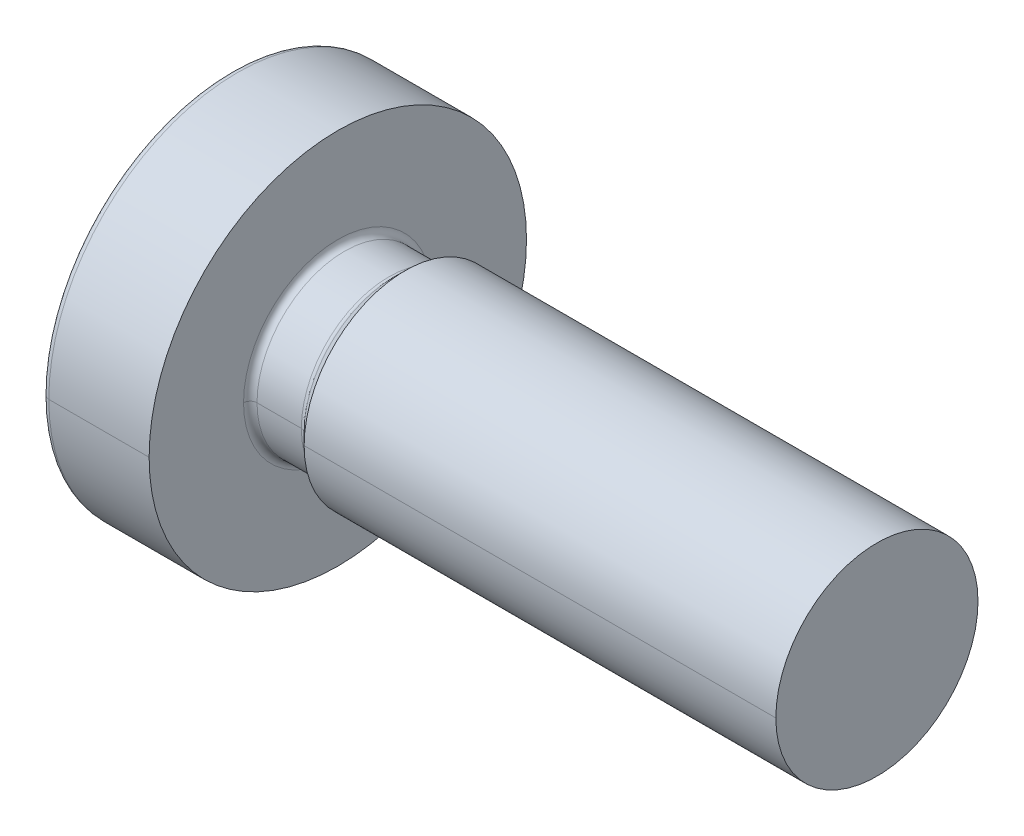
ISO-10303-21;
HEADER;
FILE_DESCRIPTION(('STEP AP214'),'2;1');
FILE_NAME('part.step','',(''),(''),'','','');
FILE_SCHEMA(('AUTOMOTIVE_DESIGN { 1 0 10303 214 1 1 1 1 }'));
ENDSEC;
DATA;
#1=APPLICATION_CONTEXT('core data for automotive mechanical design processes');
#2=APPLICATION_PROTOCOL_DEFINITION('international standard','automotive_design',2000,#1);
#3=PRODUCT_CONTEXT('',#1,'mechanical');
#4=PRODUCT('Part','Part','',(#3));
#5=PRODUCT_RELATED_PRODUCT_CATEGORY('part','',(#4));
#6=PRODUCT_DEFINITION_FORMATION('','',#4);
#7=PRODUCT_DEFINITION_CONTEXT('part definition',#1,'design');
#8=PRODUCT_DEFINITION('design','',#6,#7);
#9=PRODUCT_DEFINITION_SHAPE('','',#8);
#10=(LENGTH_UNIT() NAMED_UNIT(*) SI_UNIT(.MILLI.,.METRE.));
#11=(NAMED_UNIT(*) PLANE_ANGLE_UNIT() SI_UNIT($,.RADIAN.));
#12=(NAMED_UNIT(*) SI_UNIT($,.STERADIAN.) SOLID_ANGLE_UNIT());
#13=UNCERTAINTY_MEASURE_WITH_UNIT(LENGTH_MEASURE(1.E-05),#10,'distance_accuracy_value','');
#14=(GEOMETRIC_REPRESENTATION_CONTEXT(3) GLOBAL_UNCERTAINTY_ASSIGNED_CONTEXT((#13)) GLOBAL_UNIT_ASSIGNED_CONTEXT((#10,
#11,#12)) REPRESENTATION_CONTEXT('',''));
#15=CARTESIAN_POINT('',(0.,0.,0.));
#16=DIRECTION('',(0.,0.,1.));
#17=DIRECTION('',(1.,0.,0.));
#18=AXIS2_PLACEMENT_3D('',#15,#16,#17);
#19=CARTESIAN_POINT('',(2.5,0.,0.));
#20=DIRECTION('',(-1.,0.,0.));
#21=DIRECTION('',(0.,0.,1.));
#22=AXIS2_PLACEMENT_3D('',#19,#20,#21);
#23=TOROIDAL_SURFACE('',#22,1.399,0.1);
#24=CARTESIAN_POINT('',(2.4,0.,0.));
#25=DIRECTION('',(-1.,0.,0.));
#26=DIRECTION('',(0.,0.,1.));
#27=AXIS2_PLACEMENT_3D('',#24,#25,#26);
#28=CIRCLE('',#27,1.399);
#29=CARTESIAN_POINT('',(2.4,0.,-1.399));
#30=VERTEX_POINT('',#29);
#31=CARTESIAN_POINT('',(2.4,0.,1.399));
#32=VERTEX_POINT('',#31);
#33=EDGE_CURVE('E40',#30,#32,#28,.T.);
#34=ORIENTED_EDGE('',*,*,#33,.F.);
#35=CARTESIAN_POINT('',(2.5,0.,-1.399));
#36=DIRECTION('',(0.,1.,0.));
#37=DIRECTION('',(0.,0.,1.));
#38=AXIS2_PLACEMENT_3D('',#35,#36,#37);
#39=CIRCLE('',#38,0.1);
#40=CARTESIAN_POINT('',(2.5,0.,-1.299));
#41=VERTEX_POINT('',#40);
#42=EDGE_CURVE('E10',#30,#41,#39,.T.);
#43=ORIENTED_EDGE('',*,*,#42,.T.);
#44=CARTESIAN_POINT('',(2.5,0.,0.));
#45=DIRECTION('',(1.,0.,0.));
#46=DIRECTION('',(0.,0.,1.));
#47=AXIS2_PLACEMENT_3D('',#44,#45,#46);
#48=CIRCLE('',#47,1.299);
#49=CARTESIAN_POINT('',(2.5,0.,1.299));
#50=VERTEX_POINT('',#49);
#51=EDGE_CURVE('E435',#50,#41,#48,.T.);
#52=ORIENTED_EDGE('',*,*,#51,.F.);
#53=CARTESIAN_POINT('',(2.5,0.,1.399));
#54=DIRECTION('',(0.,-1.,0.));
#55=DIRECTION('',(0.,0.,-1.));
#56=AXIS2_PLACEMENT_3D('',#53,#54,#55);
#57=CIRCLE('',#56,0.1);
#58=EDGE_CURVE('E335',#32,#50,#57,.T.);
#59=ORIENTED_EDGE('',*,*,#58,.F.);
#60=EDGE_LOOP('',(#34,#43,#52,#59));
#61=FACE_BOUND('',#60,.T.);
#62=ADVANCED_FACE('F15',(#61),#23,.F.);
#63=CARTESIAN_POINT('',(3.15757864376269,0.,0.));
#64=DIRECTION('',(-1.,0.,0.));
#65=DIRECTION('',(0.,0.,1.));
#66=AXIS2_PLACEMENT_3D('',#63,#64,#65);
#67=TOROIDAL_SURFACE('',#66,1.399,0.1);
#68=CARTESIAN_POINT('',(3.15757864376269,0.,0.));
#69=DIRECTION('',(-1.,0.,0.));
#70=DIRECTION('',(0.,0.,1.));
#71=AXIS2_PLACEMENT_3D('',#68,#69,#70);
#72=CIRCLE('',#71,1.299);
#73=CARTESIAN_POINT('',(3.15757864376269,0.,-1.299));
#74=VERTEX_POINT('',#73);
#75=CARTESIAN_POINT('',(3.15757864376269,0.,1.299));
#76=VERTEX_POINT('',#75);
#77=EDGE_CURVE('E380',#74,#76,#72,.T.);
#78=ORIENTED_EDGE('',*,*,#77,.F.);
#79=CARTESIAN_POINT('',(3.15757864376269,0.,-1.399));
#80=DIRECTION('',(0.,1.,0.));
#81=DIRECTION('',(0.,0.,1.));
#82=AXIS2_PLACEMENT_3D('',#79,#80,#81);
#83=CIRCLE('',#82,0.1);
#84=CARTESIAN_POINT('',(3.22828932188134,0.,-1.32828932188134));
#85=VERTEX_POINT('',#84);
#86=EDGE_CURVE('E26',#74,#85,#83,.T.);
#87=ORIENTED_EDGE('',*,*,#86,.T.);
#88=CARTESIAN_POINT('',(3.22828932188134,0.,0.));
#89=DIRECTION('',(1.,0.,0.));
#90=DIRECTION('',(0.,0.,-1.));
#91=AXIS2_PLACEMENT_3D('',#88,#89,#90);
#92=CIRCLE('',#91,1.32828932188134);
#93=CARTESIAN_POINT('',(3.22828932188134,0.,1.32828932188134));
#94=VERTEX_POINT('',#93);
#95=EDGE_CURVE('E437',#94,#85,#92,.T.);
#96=ORIENTED_EDGE('',*,*,#95,.F.);
#97=CARTESIAN_POINT('',(3.15757864376269,0.,1.399));
#98=DIRECTION('',(0.,-1.,0.));
#99=DIRECTION('',(0.,0.,-1.));
#100=AXIS2_PLACEMENT_3D('',#97,#98,#99);
#101=CIRCLE('',#100,0.1);
#102=EDGE_CURVE('E321',#76,#94,#101,.T.);
#103=ORIENTED_EDGE('',*,*,#102,.F.);
#104=EDGE_LOOP('',(#78,#87,#96,#103));
#105=FACE_BOUND('',#104,.T.);
#106=ADVANCED_FACE('F521',(#105),#67,.F.);
#107=CARTESIAN_POINT('',(0.910990339947826,0.,0.));
#108=DIRECTION('',(1.,0.,0.));
#109=DIRECTION('',(0.,0.,-1.));
#110=AXIS2_PLACEMENT_3D('',#107,#108,#109);
#111=TOROIDAL_SURFACE('',#110,2.7,0.1);
#112=CARTESIAN_POINT('',(0.827541163212067,0.,0.));
#113=DIRECTION('',(-1.,0.,0.));
#114=DIRECTION('',(0.,0.,-1.));
#115=AXIS2_PLACEMENT_3D('',#112,#113,#114);
#116=CIRCLE('',#115,2.75510204081632);
#117=CARTESIAN_POINT('',(0.827541163212067,0.,2.75510204081632));
#118=VERTEX_POINT('',#117);
#119=CARTESIAN_POINT('',(0.827541163212066,2.75510204081632,0.));
#120=VERTEX_POINT('',#119);
#121=EDGE_CURVE('E295',#118,#120,#116,.T.);
#122=ORIENTED_EDGE('',*,*,#121,.F.);
#123=CARTESIAN_POINT('',(0.910990339947826,0.,2.7));
#124=DIRECTION('',(0.,1.,0.));
#125=DIRECTION('',(0.,0.,1.));
#126=AXIS2_PLACEMENT_3D('',#123,#124,#125);
#127=CIRCLE('',#126,0.1);
#128=CARTESIAN_POINT('',(0.910990339947826,0.,2.8));
#129=VERTEX_POINT('',#128);
#130=EDGE_CURVE('E454',#118,#129,#127,.T.);
#131=ORIENTED_EDGE('',*,*,#130,.T.);
#132=CARTESIAN_POINT('',(0.910990339947826,0.,0.));
#133=DIRECTION('',(1.,0.,0.));
#134=DIRECTION('',(0.,0.,-1.));
#135=AXIS2_PLACEMENT_3D('',#132,#133,#134);
#136=CIRCLE('',#135,2.8);
#137=CARTESIAN_POINT('',(0.910990339947826,0.,-2.8));
#138=VERTEX_POINT('',#137);
#139=EDGE_CURVE('E551',#138,#129,#136,.T.);
#140=ORIENTED_EDGE('',*,*,#139,.F.);
#141=CARTESIAN_POINT('',(0.910990339947826,0.,-2.7));
#142=DIRECTION('',(0.,-1.,0.));
#143=DIRECTION('',(0.,0.,-1.));
#144=AXIS2_PLACEMENT_3D('',#141,#142,#143);
#145=CIRCLE('',#144,0.1);
#146=CARTESIAN_POINT('',(0.827541163212067,0.,-2.75510204081632));
#147=VERTEX_POINT('',#146);
#148=EDGE_CURVE('E317',#147,#138,#145,.T.);
#149=ORIENTED_EDGE('',*,*,#148,.F.);
#150=CARTESIAN_POINT('',(0.827541163212067,0.,0.));
#151=DIRECTION('',(-1.,0.,0.));
#152=DIRECTION('',(0.,0.,-1.));
#153=AXIS2_PLACEMENT_3D('',#150,#151,#152);
#154=CIRCLE('',#153,2.75510204081632);
#155=EDGE_CURVE('E445',#120,#147,#154,.T.);
#156=ORIENTED_EDGE('',*,*,#155,.F.);
#157=EDGE_LOOP('',(#122,#131,#140,#149,#156));
#158=FACE_BOUND('',#157,.T.);
#159=ADVANCED_FACE('F651',(#158),#111,.T.);
#160=CARTESIAN_POINT('',(-3.4420013783492,0.,0.));
#161=DIRECTION('',(-1.,0.,0.));
#162=DIRECTION('',(0.,0.,1.));
#163=AXIS2_PLACEMENT_3D('',#160,#161,#162);
#164=CYLINDRICAL_SURFACE('',#163,1.5);
#165=CARTESIAN_POINT('',(10.4,0.,0.));
#166=DIRECTION('',(-1.,0.,0.));
#167=DIRECTION('',(0.,0.,1.));
#168=AXIS2_PLACEMENT_3D('',#165,#166,#167);
#169=CIRCLE('',#168,1.5);
#170=CARTESIAN_POINT('',(10.4,0.,1.5));
#171=VERTEX_POINT('',#170);
#172=CARTESIAN_POINT('',(10.4,0.,-1.5));
#173=VERTEX_POINT('',#172);
#174=EDGE_CURVE('E478',#171,#173,#169,.T.);
#175=ORIENTED_EDGE('',*,*,#174,.T.);
#176=DIRECTION('',(-1.,0.,0.));
#177=VECTOR('',#176,1.);
#178=CARTESIAN_POINT('',(-3.4420013783492,0.,-1.5));
#179=LINE('',#178,#177);
#180=CARTESIAN_POINT('',(3.4,0.,-1.5));
#181=VERTEX_POINT('',#180);
#182=EDGE_CURVE('E503',#173,#181,#179,.T.);
#183=ORIENTED_EDGE('',*,*,#182,.T.);
#184=CARTESIAN_POINT('',(3.4,0.,0.));
#185=DIRECTION('',(-1.,0.,0.));
#186=DIRECTION('',(0.,0.,1.));
#187=AXIS2_PLACEMENT_3D('',#184,#185,#186);
#188=CIRCLE('',#187,1.5);
#189=CARTESIAN_POINT('',(3.4,0.,1.5));
#190=VERTEX_POINT('',#189);
#191=EDGE_CURVE('E311',#190,#181,#188,.T.);
#192=ORIENTED_EDGE('',*,*,#191,.F.);
#193=DIRECTION('',(-1.,0.,0.));
#194=VECTOR('',#193,1.);
#195=CARTESIAN_POINT('',(-3.4420013783492,0.,1.5));
#196=LINE('',#195,#194);
#197=EDGE_CURVE('E320',#171,#190,#196,.T.);
#198=ORIENTED_EDGE('',*,*,#197,.F.);
#199=EDGE_LOOP('',(#175,#183,#192,#198));
#200=FACE_BOUND('',#199,.T.);
#201=ADVANCED_FACE('F537',(#200),#164,.T.);
#202=CARTESIAN_POINT('',(3.4,0.,0.));
#203=DIRECTION('',(1.,0.,0.));
#204=DIRECTION('',(0.,0.,-1.));
#205=AXIS2_PLACEMENT_3D('',#202,#203,#204);
#206=CONICAL_SURFACE('',#205,1.5,0.78539816339744);
#207=CARTESIAN_POINT('',(3.22828932188134,0.,0.));
#208=DIRECTION('',(1.,0.,0.));
#209=DIRECTION('',(0.,0.,-1.));
#210=AXIS2_PLACEMENT_3D('',#207,#208,#209);
#211=CIRCLE('',#210,1.32828932188134);
#212=EDGE_CURVE('E394',#85,#94,#211,.T.);
#213=ORIENTED_EDGE('',*,*,#212,.T.);
#214=DIRECTION('',(0.707106781186554,0.,0.707106781186541));
#215=VECTOR('',#214,1.);
#216=CARTESIAN_POINT('',(3.4,0.,1.5));
#217=LINE('',#216,#215);
#218=EDGE_CURVE('E315',#94,#190,#217,.T.);
#219=ORIENTED_EDGE('',*,*,#218,.T.);
#220=ORIENTED_EDGE('',*,*,#191,.T.);
#221=DIRECTION('',(0.707106781186554,0.,-0.707106781186541));
#222=VECTOR('',#221,1.);
#223=CARTESIAN_POINT('',(3.4,0.,-1.5));
#224=LINE('',#223,#222);
#225=EDGE_CURVE('E450',#85,#181,#224,.T.);
#226=ORIENTED_EDGE('',*,*,#225,.F.);
#227=EDGE_LOOP('',(#213,#219,#220,#226));
#228=FACE_BOUND('',#227,.T.);
#229=ADVANCED_FACE('F526',(#228),#206,.T.);
#230=CARTESIAN_POINT('',(-3.4420013783492,0.,0.));
#231=DIRECTION('',(-1.,0.,0.));
#232=DIRECTION('',(0.,0.,1.));
#233=AXIS2_PLACEMENT_3D('',#230,#231,#232);
#234=CYLINDRICAL_SURFACE('',#233,1.299);
#235=CARTESIAN_POINT('',(3.15757864376269,0.,0.));
#236=DIRECTION('',(-1.,0.,0.));
#237=DIRECTION('',(0.,0.,1.));
#238=AXIS2_PLACEMENT_3D('',#235,#236,#237);
#239=CIRCLE('',#238,1.299);
#240=EDGE_CURVE('E316',#76,#74,#239,.T.);
#241=ORIENTED_EDGE('',*,*,#240,.T.);
#242=DIRECTION('',(-1.,0.,0.));
#243=VECTOR('',#242,1.);
#244=CARTESIAN_POINT('',(-3.4420013783492,0.,-1.299));
#245=LINE('',#244,#243);
#246=EDGE_CURVE('E372',#74,#41,#245,.T.);
#247=ORIENTED_EDGE('',*,*,#246,.T.);
#248=CARTESIAN_POINT('',(2.5,0.,0.));
#249=DIRECTION('',(1.,0.,0.));
#250=DIRECTION('',(0.,0.,1.));
#251=AXIS2_PLACEMENT_3D('',#248,#249,#250);
#252=CIRCLE('',#251,1.299);
#253=EDGE_CURVE('E287',#41,#50,#252,.T.);
#254=ORIENTED_EDGE('',*,*,#253,.T.);
#255=DIRECTION('',(-1.,0.,0.));
#256=VECTOR('',#255,1.);
#257=CARTESIAN_POINT('',(-3.4420013783492,0.,1.299));
#258=LINE('',#257,#256);
#259=EDGE_CURVE('E384',#76,#50,#258,.T.);
#260=ORIENTED_EDGE('',*,*,#259,.F.);
#261=EDGE_LOOP('',(#241,#247,#254,#260));
#262=FACE_BOUND('',#261,.T.);
#263=ADVANCED_FACE('F581',(#262),#234,.T.);
#264=CARTESIAN_POINT('',(-3.4420013783492,0.,0.));
#265=DIRECTION('',(-1.,0.,0.));
#266=DIRECTION('',(0.,0.,1.));
#267=AXIS2_PLACEMENT_3D('',#264,#265,#266);
#268=CYLINDRICAL_SURFACE('',#267,2.8);
#269=CARTESIAN_POINT('',(2.4,0.,0.));
#270=DIRECTION('',(-1.,0.,0.));
#271=DIRECTION('',(0.,0.,1.));
#272=AXIS2_PLACEMENT_3D('',#269,#270,#271);
#273=CIRCLE('',#272,2.8);
#274=CARTESIAN_POINT('',(2.4,0.,2.8));
#275=VERTEX_POINT('',#274);
#276=CARTESIAN_POINT('',(2.4,0.,-2.8));
#277=VERTEX_POINT('',#276);
#278=EDGE_CURVE('E550',#275,#277,#273,.T.);
#279=ORIENTED_EDGE('',*,*,#278,.T.);
#280=DIRECTION('',(-1.,0.,0.));
#281=VECTOR('',#280,1.);
#282=CARTESIAN_POINT('',(-3.4420013783492,0.,-2.8));
#283=LINE('',#282,#281);
#284=EDGE_CURVE('E201',#277,#138,#283,.T.);
#285=ORIENTED_EDGE('',*,*,#284,.T.);
#286=ORIENTED_EDGE('',*,*,#139,.T.);
#287=DIRECTION('',(-1.,0.,0.));
#288=VECTOR('',#287,1.);
#289=CARTESIAN_POINT('',(-3.4420013783492,0.,2.8));
#290=LINE('',#289,#288);
#291=EDGE_CURVE('E212',#275,#129,#290,.T.);
#292=ORIENTED_EDGE('',*,*,#291,.F.);
#293=EDGE_LOOP('',(#279,#285,#286,#292));
#294=FACE_BOUND('',#293,.T.);
#295=ADVANCED_FACE('F674',(#294),#268,.T.);
#296=CARTESIAN_POINT('',(5.,0.,0.));
#297=DIRECTION('',(0.,0.,-1.));
#298=DIRECTION('',(0.,1.,0.));
#299=AXIS2_PLACEMENT_3D('',#296,#297,#298);
#300=SPHERICAL_SURFACE('',#299,5.);
#301=ORIENTED_EDGE('',*,*,#155,.T.);
#302=CARTESIAN_POINT('',(0.827541163212067,0.,0.));
#303=DIRECTION('',(-1.,0.,0.));
#304=DIRECTION('',(0.,0.,-1.));
#305=AXIS2_PLACEMENT_3D('',#302,#303,#304);
#306=CIRCLE('',#305,2.75510204081632);
#307=CARTESIAN_POINT('',(0.827541163212066,-2.75510204081632,0.));
#308=VERTEX_POINT('',#307);
#309=EDGE_CURVE('E293',#147,#308,#306,.T.);
#310=ORIENTED_EDGE('',*,*,#309,.T.);
#311=CARTESIAN_POINT('',(5.,0.,0.));
#312=DIRECTION('',(0.,0.,-1.));
#313=DIRECTION('',(0.,1.,0.));
#314=AXIS2_PLACEMENT_3D('',#311,#312,#313);
#315=CIRCLE('',#314,5.);
#316=CARTESIAN_POINT('',(0.0483882559325496,-0.693931650822548,0.));
#317=VERTEX_POINT('',#316);
#318=EDGE_CURVE('E289',#308,#317,#315,.T.);
#319=ORIENTED_EDGE('',*,*,#318,.T.);
#320=CARTESIAN_POINT('',(5.00907871968526,-0.073940238239228,0.0283829982019893));
#321=DIRECTION('',(0.113883497498907,-0.927506656060475,0.356036447517571));
#322=DIRECTION('',(0.,-0.358367949545293,-0.933580426497205));
#323=AXIS2_PLACEMENT_3D('',#320,#321,#322);
#324=CIRCLE('',#323,4.9993644419497);
#325=CARTESIAN_POINT('',(0.0743133377131422,-0.805315831954644,-0.298458231192017));
#326=VERTEX_POINT('',#325);
#327=EDGE_CURVE('E294',#317,#326,#324,.T.);
#328=ORIENTED_EDGE('',*,*,#327,.T.);
#329=CARTESIAN_POINT('',(4.99447111284247,0.0450291723721179,-0.0434841662986069));
#330=DIRECTION('',(0.0879813128153511,-0.716550290756221,0.691964572368025));
#331=DIRECTION('',(0.,-0.694658370458996,-0.719339800338653));
#332=AXIS2_PLACEMENT_3D('',#329,#330,#331);
#333=CIRCLE('',#332,4.99960507763599);
#334=CARTESIAN_POINT('',(0.212229293358308,-1.22830113216143,-0.754007950458526));
#335=VERTEX_POINT('',#334);
#336=EDGE_CURVE('E404',#326,#335,#333,.T.);
#337=ORIENTED_EDGE('',*,*,#336,.T.);
#338=CARTESIAN_POINT('',(4.60651618361134,0.558053223935769,0.55805322393577));
#339=DIRECTION('',(-0.446197814505031,0.632814155313759,0.63281415531376));
#340=DIRECTION('',(0.,-0.707106781186548,0.707106781186547));
#341=AXIS2_PLACEMENT_3D('',#338,#339,#340);
#342=CIRCLE('',#341,4.92161799459791);
#343=CARTESIAN_POINT('',(0.212229294438488,-0.754007950138534,-1.22830113171978));
#344=VERTEX_POINT('',#343);
#345=EDGE_CURVE('E327',#344,#335,#342,.T.);
#346=ORIENTED_EDGE('',*,*,#345,.F.);
#347=CARTESIAN_POINT('',(4.99447111284247,-0.0434841662986056,0.0450291723721165));
#348=DIRECTION('',(0.0879813128153507,0.691964572368025,-0.716550290756221));
#349=DIRECTION('',(0.,0.719339800338653,0.694658370458996));
#350=AXIS2_PLACEMENT_3D('',#347,#348,#349);
#351=CIRCLE('',#350,4.99960507763599);
#352=CARTESIAN_POINT('',(0.0743133377131075,-0.298458231192018,-0.805315831954648));
#353=VERTEX_POINT('',#352);
#354=EDGE_CURVE('E265',#344,#353,#351,.T.);
#355=ORIENTED_EDGE('',*,*,#354,.T.);
#356=CARTESIAN_POINT('',(5.00907871968526,0.0283829982019898,-0.0739402382392289));
#357=DIRECTION('',(0.113883497498906,0.356036447517571,-0.927506656060475));
#358=DIRECTION('',(0.,0.933580426497205,0.358367949545293));
#359=AXIS2_PLACEMENT_3D('',#356,#357,#358);
#360=CIRCLE('',#359,4.9993644419497);
#361=CARTESIAN_POINT('',(0.04838825593255,0.,-0.693931650822548));
#362=VERTEX_POINT('',#361);
#363=EDGE_CURVE('E19',#353,#362,#360,.T.);
#364=ORIENTED_EDGE('',*,*,#363,.T.);
#365=CARTESIAN_POINT('',(5.00907871968526,-0.0283829982019896,-0.0739402382392284));
#366=DIRECTION('',(0.113883497498906,-0.356036447517572,-0.927506656060475));
#367=DIRECTION('',(0.,0.933580426497204,-0.358367949545294));
#368=AXIS2_PLACEMENT_3D('',#365,#366,#367);
#369=CIRCLE('',#368,4.9993644419497);
#370=CARTESIAN_POINT('',(0.0743133377131416,0.298458231192017,-0.805315831954644));
#371=VERTEX_POINT('',#370);
#372=EDGE_CURVE('E249',#362,#371,#369,.T.);
#373=ORIENTED_EDGE('',*,*,#372,.T.);
#374=CARTESIAN_POINT('',(4.99447111284247,0.043484166298606,0.0450291723721169));
#375=DIRECTION('',(0.0879813128153509,-0.691964572368024,-0.716550290756221));
#376=DIRECTION('',(0.,0.719339800338653,-0.694658370458996));
#377=AXIS2_PLACEMENT_3D('',#374,#375,#376);
#378=CIRCLE('',#377,4.99960507763599);
#379=CARTESIAN_POINT('',(0.212229293358308,0.754007950458526,-1.22830113216143));
#380=VERTEX_POINT('',#379);
#381=EDGE_CURVE('E259',#371,#380,#378,.T.);
#382=ORIENTED_EDGE('',*,*,#381,.T.);
#383=CARTESIAN_POINT('',(4.60651618361134,-0.558053223935769,0.558053223935769));
#384=DIRECTION('',(-0.446197814505031,-0.63281415531376,0.63281415531376));
#385=DIRECTION('',(0.,-0.707106781186548,-0.707106781186547));
#386=AXIS2_PLACEMENT_3D('',#383,#384,#385);
#387=CIRCLE('',#386,4.92161799459791);
#388=CARTESIAN_POINT('',(0.212229293358308,1.22830113216143,-0.754007950458526));
#389=VERTEX_POINT('',#388);
#390=EDGE_CURVE('E305',#389,#380,#387,.T.);
#391=ORIENTED_EDGE('',*,*,#390,.F.);
#392=CARTESIAN_POINT('',(4.99447111284247,-0.0450291723721175,-0.0434841662986066));
#393=DIRECTION('',(0.087981312815351,0.716550290756221,0.691964572368025));
#394=DIRECTION('',(0.,-0.694658370458996,0.719339800338653));
#395=AXIS2_PLACEMENT_3D('',#392,#393,#394);
#396=CIRCLE('',#395,4.99960507763599);
#397=CARTESIAN_POINT('',(0.0743133377131069,0.805315831954649,-0.298458231192017));
#398=VERTEX_POINT('',#397);
#399=EDGE_CURVE('E306',#389,#398,#396,.T.);
#400=ORIENTED_EDGE('',*,*,#399,.T.);
#401=CARTESIAN_POINT('',(5.00907871968526,0.0739402382392284,0.0283829982019895));
#402=DIRECTION('',(0.113883497498906,0.927506656060475,0.356036447517571));
#403=DIRECTION('',(0.,-0.358367949545293,0.933580426497205));
#404=AXIS2_PLACEMENT_3D('',#401,#402,#403);
#405=CIRCLE('',#404,4.9993644419497);
#406=CARTESIAN_POINT('',(0.0483882559325506,0.693931650822548,0.));
#407=VERTEX_POINT('',#406);
#408=EDGE_CURVE('E310',#398,#407,#405,.T.);
#409=ORIENTED_EDGE('',*,*,#408,.T.);
#410=CARTESIAN_POINT('',(5.,0.,0.));
#411=DIRECTION('',(0.,0.,1.));
#412=DIRECTION('',(1.,0.,0.));
#413=AXIS2_PLACEMENT_3D('',#410,#411,#412);
#414=CIRCLE('',#413,5.);
#415=EDGE_CURVE('E299',#120,#407,#414,.T.);
#416=ORIENTED_EDGE('',*,*,#415,.F.);
#417=EDGE_LOOP('',(#301,#310,#319,#328,#337,#346,#355,#364,#373,#382,#391,#400,#409,#416));
#418=FACE_BOUND('',#417,.T.);
#419=ADVANCED_FACE('F263',(#418),#300,.T.);
#420=CARTESIAN_POINT('',(5.,0.,0.));
#421=DIRECTION('',(0.,0.,-1.));
#422=DIRECTION('',(0.,1.,0.));
#423=AXIS2_PLACEMENT_3D('',#420,#421,#422);
#424=SPHERICAL_SURFACE('',#423,5.);
#425=ORIENTED_EDGE('',*,*,#318,.F.);
#426=CARTESIAN_POINT('',(0.827541163212067,0.,0.));
#427=DIRECTION('',(-1.,0.,0.));
#428=DIRECTION('',(0.,0.,-1.));
#429=AXIS2_PLACEMENT_3D('',#426,#427,#428);
#430=CIRCLE('',#429,2.75510204081632);
#431=EDGE_CURVE('E298',#308,#118,#430,.T.);
#432=ORIENTED_EDGE('',*,*,#431,.T.);
#433=ORIENTED_EDGE('',*,*,#121,.T.);
#434=ORIENTED_EDGE('',*,*,#415,.T.);
#435=CARTESIAN_POINT('',(5.00907871968526,0.0739402382392284,-0.0283829982019895));
#436=DIRECTION('',(0.113883497498906,0.927506656060475,-0.356036447517571));
#437=DIRECTION('',(0.,0.358367949545293,0.933580426497205));
#438=AXIS2_PLACEMENT_3D('',#435,#436,#437);
#439=CIRCLE('',#438,4.9993644419497);
#440=CARTESIAN_POINT('',(0.0743133377131422,0.805315831954644,0.298458231192017));
#441=VERTEX_POINT('',#440);
#442=EDGE_CURVE('E357',#407,#441,#439,.T.);
#443=ORIENTED_EDGE('',*,*,#442,.T.);
#444=CARTESIAN_POINT('',(4.99447111284247,-0.0450291723721173,0.0434841662986063));
#445=DIRECTION('',(0.0879813128153509,0.716550290756221,-0.691964572368025));
#446=DIRECTION('',(0.,0.694658370458996,0.719339800338653));
#447=AXIS2_PLACEMENT_3D('',#444,#445,#446);
#448=CIRCLE('',#447,4.99960507763599);
#449=CARTESIAN_POINT('',(0.212229293358308,1.22830113216143,0.754007950458526));
#450=VERTEX_POINT('',#449);
#451=EDGE_CURVE('E361',#441,#450,#448,.T.);
#452=ORIENTED_EDGE('',*,*,#451,.T.);
#453=CARTESIAN_POINT('',(4.60651618361134,-0.558053223935769,-0.55805322393577));
#454=DIRECTION('',(-0.446197814505031,-0.63281415531376,-0.63281415531376));
#455=DIRECTION('',(0.,0.707106781186548,-0.707106781186547));
#456=AXIS2_PLACEMENT_3D('',#453,#454,#455);
#457=CIRCLE('',#456,4.92161799459792);
#458=CARTESIAN_POINT('',(0.212229294438488,0.754007950138533,1.22830113171978));
#459=VERTEX_POINT('',#458);
#460=EDGE_CURVE('E459',#459,#450,#457,.T.);
#461=ORIENTED_EDGE('',*,*,#460,.F.);
#462=CARTESIAN_POINT('',(4.99447111284247,0.043484166298606,-0.0450291723721169));
#463=DIRECTION('',(0.0879813128153509,-0.691964572368024,0.716550290756221));
#464=DIRECTION('',(0.,-0.719339800338653,-0.694658370458996));
#465=AXIS2_PLACEMENT_3D('',#462,#463,#464);
#466=CIRCLE('',#465,4.99960507763599);
#467=CARTESIAN_POINT('',(0.0743133377131075,0.298458231192017,0.805315831954648));
#468=VERTEX_POINT('',#467);
#469=EDGE_CURVE('E379',#459,#468,#466,.T.);
#470=ORIENTED_EDGE('',*,*,#469,.T.);
#471=CARTESIAN_POINT('',(5.00907871968526,-0.0283829982019896,0.0739402382392284));
#472=DIRECTION('',(0.113883497498906,-0.356036447517572,0.927506656060475));
#473=DIRECTION('',(0.,-0.933580426497204,-0.358367949545294));
#474=AXIS2_PLACEMENT_3D('',#471,#472,#473);
#475=CIRCLE('',#474,4.9993644419497);
#476=CARTESIAN_POINT('',(0.0483882559325501,0.,0.693931650822548));
#477=VERTEX_POINT('',#476);
#478=EDGE_CURVE('E395',#468,#477,#475,.T.);
#479=ORIENTED_EDGE('',*,*,#478,.T.);
#480=CARTESIAN_POINT('',(5.00907871968526,0.0283829982019898,0.0739402382392289));
#481=DIRECTION('',(0.113883497498906,0.356036447517571,0.927506656060475));
#482=DIRECTION('',(0.,-0.933580426497205,0.358367949545293));
#483=AXIS2_PLACEMENT_3D('',#480,#481,#482);
#484=CIRCLE('',#483,4.9993644419497);
#485=CARTESIAN_POINT('',(0.0743133377131421,-0.298458231192018,0.805315831954644));
#486=VERTEX_POINT('',#485);
#487=EDGE_CURVE('E399',#477,#486,#484,.T.);
#488=ORIENTED_EDGE('',*,*,#487,.T.);
#489=CARTESIAN_POINT('',(4.99447111284247,-0.0434841662986054,-0.0450291723721164));
#490=DIRECTION('',(0.0879813128153507,0.691964572368024,0.716550290756221));
#491=DIRECTION('',(0.,-0.719339800338653,0.694658370458996));
#492=AXIS2_PLACEMENT_3D('',#489,#490,#491);
#493=CIRCLE('',#492,4.99960507763599);
#494=CARTESIAN_POINT('',(0.212229293358308,-0.754007950458526,1.22830113216143));
#495=VERTEX_POINT('',#494);
#496=EDGE_CURVE('E423',#486,#495,#493,.T.);
#497=ORIENTED_EDGE('',*,*,#496,.T.);
#498=CARTESIAN_POINT('',(4.60651618361134,0.558053223935768,-0.558053223935769));
#499=DIRECTION('',(-0.446197814505031,0.632814155313759,-0.63281415531376));
#500=DIRECTION('',(0.,0.707106781186548,0.707106781186547));
#501=AXIS2_PLACEMENT_3D('',#498,#499,#500);
#502=CIRCLE('',#501,4.92161799459792);
#503=CARTESIAN_POINT('',(0.212229294438489,-1.22830113171978,0.754007950138533));
#504=VERTEX_POINT('',#503);
#505=EDGE_CURVE('E345',#504,#495,#502,.T.);
#506=ORIENTED_EDGE('',*,*,#505,.F.);
#507=CARTESIAN_POINT('',(4.99447111284247,0.0450291723721179,0.0434841662986069));
#508=DIRECTION('',(0.0879813128153511,-0.716550290756221,-0.691964572368025));
#509=DIRECTION('',(0.,0.694658370458996,-0.719339800338653));
#510=AXIS2_PLACEMENT_3D('',#507,#508,#509);
#511=CIRCLE('',#510,4.99960507763599);
#512=CARTESIAN_POINT('',(0.0743133377131069,-0.805315831954648,0.298458231192017));
#513=VERTEX_POINT('',#512);
#514=EDGE_CURVE('E420',#504,#513,#511,.T.);
#515=ORIENTED_EDGE('',*,*,#514,.T.);
#516=CARTESIAN_POINT('',(5.00907871968526,-0.0739402382392281,-0.0283829982019894));
#517=DIRECTION('',(0.113883497498907,-0.927506656060475,-0.356036447517571));
#518=DIRECTION('',(0.,0.358367949545293,-0.933580426497205));
#519=AXIS2_PLACEMENT_3D('',#516,#517,#518);
#520=CIRCLE('',#519,4.9993644419497);
#521=EDGE_CURVE('E424',#513,#317,#520,.T.);
#522=ORIENTED_EDGE('',*,*,#521,.T.);
#523=EDGE_LOOP('',(#425,#432,#433,#434,#443,#452,#461,#470,#479,#488,#497,#506,#515,#522));
#524=FACE_BOUND('',#523,.T.);
#525=ADVANCED_FACE('F673',(#524),#424,.T.);
#526=CARTESIAN_POINT('',(-3.4420013783492,0.,0.));
#527=DIRECTION('',(-1.,0.,0.));
#528=DIRECTION('',(0.,0.,1.));
#529=AXIS2_PLACEMENT_3D('',#526,#527,#528);
#530=CYLINDRICAL_SURFACE('',#529,2.8);
#531=ORIENTED_EDGE('',*,*,#284,.F.);
#532=CARTESIAN_POINT('',(2.4,0.,0.));
#533=DIRECTION('',(-1.,0.,0.));
#534=DIRECTION('',(0.,0.,1.));
#535=AXIS2_PLACEMENT_3D('',#532,#533,#534);
#536=CIRCLE('',#535,2.8);
#537=EDGE_CURVE('E349',#277,#275,#536,.T.);
#538=ORIENTED_EDGE('',*,*,#537,.T.);
#539=ORIENTED_EDGE('',*,*,#291,.T.);
#540=CARTESIAN_POINT('',(0.910990339947826,0.,0.));
#541=DIRECTION('',(1.,0.,0.));
#542=DIRECTION('',(0.,0.,-1.));
#543=AXIS2_PLACEMENT_3D('',#540,#541,#542);
#544=CIRCLE('',#543,2.8);
#545=EDGE_CURVE('E350',#129,#138,#544,.T.);
#546=ORIENTED_EDGE('',*,*,#545,.T.);
#547=EDGE_LOOP('',(#531,#538,#539,#546));
#548=FACE_BOUND('',#547,.T.);
#549=ADVANCED_FACE('F675',(#548),#530,.T.);
#550=CARTESIAN_POINT('',(2.4,2.8,0.));
#551=DIRECTION('',(-1.,0.,0.));
#552=DIRECTION('',(0.,0.,1.));
#553=AXIS2_PLACEMENT_3D('',#550,#551,#552);
#554=PLANE('',#553);
#555=ORIENTED_EDGE('',*,*,#278,.F.);
#556=ORIENTED_EDGE('',*,*,#537,.F.);
#557=EDGE_LOOP('',(#555,#556));
#558=FACE_BOUND('',#557,.T.);
#559=CARTESIAN_POINT('',(2.4,0.,0.));
#560=DIRECTION('',(-1.,0.,0.));
#561=DIRECTION('',(0.,0.,1.));
#562=AXIS2_PLACEMENT_3D('',#559,#560,#561);
#563=CIRCLE('',#562,1.399);
#564=EDGE_CURVE('E387',#32,#30,#563,.T.);
#565=ORIENTED_EDGE('',*,*,#564,.T.);
#566=ORIENTED_EDGE('',*,*,#33,.T.);
#567=EDGE_LOOP('',(#565,#566));
#568=FACE_BOUND('',#567,.T.);
#569=ADVANCED_FACE('F678',(#558,#568),#554,.F.);
#570=CARTESIAN_POINT('',(-3.4420013783492,0.,0.));
#571=DIRECTION('',(-1.,0.,0.));
#572=DIRECTION('',(0.,0.,1.));
#573=AXIS2_PLACEMENT_3D('',#570,#571,#572);
#574=CYLINDRICAL_SURFACE('',#573,1.299);
#575=ORIENTED_EDGE('',*,*,#246,.F.);
#576=ORIENTED_EDGE('',*,*,#77,.T.);
#577=ORIENTED_EDGE('',*,*,#259,.T.);
#578=ORIENTED_EDGE('',*,*,#51,.T.);
#579=EDGE_LOOP('',(#575,#576,#577,#578));
#580=FACE_BOUND('',#579,.T.);
#581=ADVANCED_FACE('F577',(#580),#574,.T.);
#582=CARTESIAN_POINT('',(3.4,0.,0.));
#583=DIRECTION('',(1.,0.,0.));
#584=DIRECTION('',(0.,0.,-1.));
#585=AXIS2_PLACEMENT_3D('',#582,#583,#584);
#586=CONICAL_SURFACE('',#585,1.5,0.78539816339744);
#587=ORIENTED_EDGE('',*,*,#218,.F.);
#588=ORIENTED_EDGE('',*,*,#95,.T.);
#589=ORIENTED_EDGE('',*,*,#225,.T.);
#590=CARTESIAN_POINT('',(3.4,0.,0.));
#591=DIRECTION('',(-1.,0.,0.));
#592=DIRECTION('',(0.,0.,1.));
#593=AXIS2_PLACEMENT_3D('',#590,#591,#592);
#594=CIRCLE('',#593,1.5);
#595=EDGE_CURVE('E471',#181,#190,#594,.T.);
#596=ORIENTED_EDGE('',*,*,#595,.T.);
#597=EDGE_LOOP('',(#587,#588,#589,#596));
#598=FACE_BOUND('',#597,.T.);
#599=ADVANCED_FACE('F528',(#598),#586,.T.);
#600=CARTESIAN_POINT('',(-3.4420013783492,0.,0.));
#601=DIRECTION('',(-1.,0.,0.));
#602=DIRECTION('',(0.,0.,1.));
#603=AXIS2_PLACEMENT_3D('',#600,#601,#602);
#604=CYLINDRICAL_SURFACE('',#603,1.5);
#605=ORIENTED_EDGE('',*,*,#182,.F.);
#606=CARTESIAN_POINT('',(10.4,0.,0.));
#607=DIRECTION('',(-1.,0.,0.));
#608=DIRECTION('',(0.,0.,1.));
#609=AXIS2_PLACEMENT_3D('',#606,#607,#608);
#610=CIRCLE('',#609,1.5);
#611=EDGE_CURVE('E466',#173,#171,#610,.T.);
#612=ORIENTED_EDGE('',*,*,#611,.T.);
#613=ORIENTED_EDGE('',*,*,#197,.T.);
#614=ORIENTED_EDGE('',*,*,#595,.F.);
#615=EDGE_LOOP('',(#605,#612,#613,#614));
#616=FACE_BOUND('',#615,.T.);
#617=ADVANCED_FACE('F531',(#616),#604,.T.);
#618=CARTESIAN_POINT('',(10.4,0.,0.));
#619=DIRECTION('',(-1.,0.,0.));
#620=DIRECTION('',(0.,0.,1.));
#621=AXIS2_PLACEMENT_3D('',#618,#619,#620);
#622=PLANE('',#621);
#623=ORIENTED_EDGE('',*,*,#174,.F.);
#624=ORIENTED_EDGE('',*,*,#611,.F.);
#625=EDGE_LOOP('',(#623,#624));
#626=FACE_BOUND('',#625,.T.);
#627=ADVANCED_FACE('F681',(#626),#622,.F.);
#628=CARTESIAN_POINT('',(0.910990339947826,0.,0.));
#629=DIRECTION('',(1.,0.,0.));
#630=DIRECTION('',(0.,0.,-1.));
#631=AXIS2_PLACEMENT_3D('',#628,#629,#630);
#632=TOROIDAL_SURFACE('',#631,2.7,0.1);
#633=ORIENTED_EDGE('',*,*,#130,.F.);
#634=ORIENTED_EDGE('',*,*,#431,.F.);
#635=ORIENTED_EDGE('',*,*,#309,.F.);
#636=ORIENTED_EDGE('',*,*,#148,.T.);
#637=ORIENTED_EDGE('',*,*,#545,.F.);
#638=EDGE_LOOP('',(#633,#634,#635,#636,#637));
#639=FACE_BOUND('',#638,.T.);
#640=ADVANCED_FACE('F705',(#639),#632,.T.);
#641=CARTESIAN_POINT('',(3.15757864376269,0.,0.));
#642=DIRECTION('',(-1.,0.,0.));
#643=DIRECTION('',(0.,0.,1.));
#644=AXIS2_PLACEMENT_3D('',#641,#642,#643);
#645=TOROIDAL_SURFACE('',#644,1.399,0.1);
#646=ORIENTED_EDGE('',*,*,#86,.F.);
#647=ORIENTED_EDGE('',*,*,#240,.F.);
#648=ORIENTED_EDGE('',*,*,#102,.T.);
#649=ORIENTED_EDGE('',*,*,#212,.F.);
#650=EDGE_LOOP('',(#646,#647,#648,#649));
#651=FACE_BOUND('',#650,.T.);
#652=ADVANCED_FACE('F516',(#651),#645,.F.);
#653=CARTESIAN_POINT('',(2.5,0.,0.));
#654=DIRECTION('',(-1.,0.,0.));
#655=DIRECTION('',(0.,0.,1.));
#656=AXIS2_PLACEMENT_3D('',#653,#654,#655);
#657=TOROIDAL_SURFACE('',#656,1.399,0.1);
#658=ORIENTED_EDGE('',*,*,#42,.F.);
#659=ORIENTED_EDGE('',*,*,#564,.F.);
#660=ORIENTED_EDGE('',*,*,#58,.T.);
#661=ORIENTED_EDGE('',*,*,#253,.F.);
#662=EDGE_LOOP('',(#658,#659,#660,#661));
#663=FACE_BOUND('',#662,.T.);
#664=ADVANCED_FACE('F668',(#663),#657,.F.);
#665=CARTESIAN_POINT('',(0.,1.31507331423074,-0.816878828796849));
#666=DIRECTION('',(0.087981312815351,0.716550290756221,0.691964572368024));
#667=DIRECTION('',(0.992013508213441,0.,-0.126131675332015));
#668=AXIS2_PLACEMENT_3D('',#665,#666,#667);
#669=PLANE('',#668);
#670=DIRECTION('',(-0.892670261136446,0.364977639050131,-0.264444942995667));
#671=VECTOR('',#670,1.);
#672=CARTESIAN_POINT('',(0.875,0.95732034757282,-0.557668529994433));
#673=LINE('',#672,#671);
#674=CARTESIAN_POINT('',(1.75,0.599567380914899,-0.298458231192017));
#675=VERTEX_POINT('',#674);
#676=EDGE_CURVE('E351',#675,#389,#673,.T.);
#677=ORIENTED_EDGE('',*,*,#676,.F.);
#678=DIRECTION('',(0.992546151641322,-0.121869343405147,0.));
#679=VECTOR('',#678,1.);
#680=CARTESIAN_POINT('',(0.875,0.70700387170494,-0.298458231192017));
#681=LINE('',#680,#679);
#682=EDGE_CURVE('E304',#398,#675,#681,.T.);
#683=ORIENTED_EDGE('',*,*,#682,.F.);
#684=ORIENTED_EDGE('',*,*,#399,.F.);
#685=EDGE_LOOP('',(#677,#683,#684));
#686=FACE_BOUND('',#685,.T.);
#687=ADVANCED_FACE('F632',(#686),#669,.F.);
#688=CARTESIAN_POINT('',(0.,0.699872981580083,0.));
#689=DIRECTION('',(0.113883497498906,0.927506656060475,0.356036447517571));
#690=DIRECTION('',(0.952461542619365,0.,-0.304658841708457));
#691=AXIS2_PLACEMENT_3D('',#688,#689,#690);
#692=PLANE('',#691);
#693=ORIENTED_EDGE('',*,*,#682,.T.);
#694=DIRECTION('',(0.,-0.358367949545295,0.933580426497204));
#695=VECTOR('',#694,1.);
#696=CARTESIAN_POINT('',(1.75,0.485,0.));
#697=LINE('',#696,#695);
#698=CARTESIAN_POINT('',(1.75,0.485,0.));
#699=VERTEX_POINT('',#698);
#700=EDGE_CURVE('E300',#675,#699,#697,.T.);
#701=ORIENTED_EDGE('',*,*,#700,.T.);
#702=DIRECTION('',(0.992546151641322,-0.121869343405147,0.));
#703=VECTOR('',#702,1.);
#704=CARTESIAN_POINT('',(0.,0.699872981580083,0.));
#705=LINE('',#704,#703);
#706=EDGE_CURVE('E356',#407,#699,#705,.T.);
#707=ORIENTED_EDGE('',*,*,#706,.F.);
#708=ORIENTED_EDGE('',*,*,#408,.F.);
#709=EDGE_LOOP('',(#693,#701,#707,#708));
#710=FACE_BOUND('',#709,.T.);
#711=ADVANCED_FACE('F629',(#710),#692,.F.);
#712=CARTESIAN_POINT('',(1.75,0.599567380914899,-0.298458231192017));
#713=DIRECTION('',(-0.446197814505031,-0.632814155313759,0.63281415531376));
#714=DIRECTION('',(-0.817268653268361,0.576256842375794,0.));
#715=AXIS2_PLACEMENT_3D('',#712,#713,#714);
#716=PLANE('',#715);
#717=ORIENTED_EDGE('',*,*,#390,.T.);
#718=DIRECTION('',(0.892670261136446,-0.264444942995668,0.364977639050131));
#719=VECTOR('',#718,1.);
#720=CARTESIAN_POINT('',(0.875,0.557668529994433,-0.95732034757282));
#721=LINE('',#720,#719);
#722=CARTESIAN_POINT('',(1.75,0.298458231192017,-0.599567380914899));
#723=VERTEX_POINT('',#722);
#724=EDGE_CURVE('E547',#380,#723,#721,.T.);
#725=ORIENTED_EDGE('',*,*,#724,.T.);
#726=DIRECTION('',(0.,0.707106781186548,0.707106781186547));
#727=VECTOR('',#726,1.);
#728=CARTESIAN_POINT('',(1.75,0.599567380914899,-0.298458231192017));
#729=LINE('',#728,#727);
#730=EDGE_CURVE('E355',#723,#675,#729,.T.);
#731=ORIENTED_EDGE('',*,*,#730,.T.);
#732=ORIENTED_EDGE('',*,*,#676,.T.);
#733=EDGE_LOOP('',(#717,#725,#731,#732));
#734=FACE_BOUND('',#733,.T.);
#735=ADVANCED_FACE('F619',(#734),#716,.T.);
#736=CARTESIAN_POINT('',(0.,0.699872981580083,0.));
#737=DIRECTION('',(0.113883497498906,0.927506656060475,-0.356036447517571));
#738=DIRECTION('',(-0.952461542619365,0.,-0.304658841708457));
#739=AXIS2_PLACEMENT_3D('',#736,#737,#738);
#740=PLANE('',#739);
#741=ORIENTED_EDGE('',*,*,#706,.T.);
#742=DIRECTION('',(0.,0.358367949545295,0.933580426497204));
#743=VECTOR('',#742,1.);
#744=CARTESIAN_POINT('',(1.75,0.485,0.));
#745=LINE('',#744,#743);
#746=CARTESIAN_POINT('',(1.75,0.599567380914899,0.298458231192017));
#747=VERTEX_POINT('',#746);
#748=EDGE_CURVE('E367',#699,#747,#745,.T.);
#749=ORIENTED_EDGE('',*,*,#748,.T.);
#750=DIRECTION('',(0.992546151641322,-0.121869343405147,0.));
#751=VECTOR('',#750,1.);
#752=CARTESIAN_POINT('',(0.,0.814440362494981,0.298458231192017));
#753=LINE('',#752,#751);
#754=EDGE_CURVE('E371',#441,#747,#753,.T.);
#755=ORIENTED_EDGE('',*,*,#754,.F.);
#756=ORIENTED_EDGE('',*,*,#442,.F.);
#757=EDGE_LOOP('',(#741,#749,#755,#756));
#758=FACE_BOUND('',#757,.T.);
#759=ADVANCED_FACE('F660',(#758),#740,.F.);
#760=CARTESIAN_POINT('',(0.,0.814440362494981,0.298458231192017));
#761=DIRECTION('',(0.087981312815351,0.716550290756221,-0.691964572368025));
#762=DIRECTION('',(-0.992013508213441,0.,-0.126131675332015));
#763=AXIS2_PLACEMENT_3D('',#760,#761,#762);
#764=PLANE('',#763);
#765=ORIENTED_EDGE('',*,*,#754,.T.);
#766=DIRECTION('',(0.892670261136446,-0.364977639050131,-0.264444942995668));
#767=VECTOR('',#766,1.);
#768=CARTESIAN_POINT('',(0.875,0.95732034757282,0.557668529994433));
#769=LINE('',#768,#767);
#770=EDGE_CURVE('E455',#450,#747,#769,.T.);
#771=ORIENTED_EDGE('',*,*,#770,.F.);
#772=ORIENTED_EDGE('',*,*,#451,.F.);
#773=EDGE_LOOP('',(#765,#771,#772));
#774=FACE_BOUND('',#773,.T.);
#775=ADVANCED_FACE('F656',(#774),#764,.F.);
#776=CARTESIAN_POINT('',(1.75,0.298458231192017,0.599567380914899));
#777=DIRECTION('',(-0.446197814505031,-0.632814155313759,-0.63281415531376));
#778=DIRECTION('',(0.,-0.707106781186548,0.707106781186547));
#779=AXIS2_PLACEMENT_3D('',#776,#777,#778);
#780=PLANE('',#779);
#781=ORIENTED_EDGE('',*,*,#460,.T.);
#782=ORIENTED_EDGE('',*,*,#770,.T.);
#783=DIRECTION('',(0.,-0.707106781186548,0.707106781186547));
#784=VECTOR('',#783,1.);
#785=CARTESIAN_POINT('',(1.75,0.599567380914899,0.298458231192017));
#786=LINE('',#785,#784);
#787=CARTESIAN_POINT('',(1.75,0.298458231192017,0.599567380914899));
#788=VERTEX_POINT('',#787);
#789=EDGE_CURVE('E460',#747,#788,#786,.T.);
#790=ORIENTED_EDGE('',*,*,#789,.T.);
#791=DIRECTION('',(-0.892670261136446,0.264444942995668,0.364977639050131));
#792=VECTOR('',#791,1.);
#793=CARTESIAN_POINT('',(0.875,0.557668529994433,0.95732034757282));
#794=LINE('',#793,#792);
#795=EDGE_CURVE('E570',#788,#459,#794,.T.);
#796=ORIENTED_EDGE('',*,*,#795,.T.);
#797=EDGE_LOOP('',(#781,#782,#790,#796));
#798=FACE_BOUND('',#797,.T.);
#799=ADVANCED_FACE('F659',(#798),#780,.T.);
#800=CARTESIAN_POINT('',(0.,0.816878828796849,1.31507331423074));
#801=DIRECTION('',(0.0879813128153509,-0.691964572368024,0.716550290756221));
#802=DIRECTION('',(-0.992013508213441,-0.126131675332015,0.));
#803=AXIS2_PLACEMENT_3D('',#800,#801,#802);
#804=PLANE('',#803);
#805=ORIENTED_EDGE('',*,*,#795,.F.);
#806=DIRECTION('',(0.992546151641322,0.,-0.121869343405147));
#807=VECTOR('',#806,1.);
#808=CARTESIAN_POINT('',(0.875,0.298458231192017,0.70700387170494));
#809=LINE('',#808,#807);
#810=EDGE_CURVE('E340',#468,#788,#809,.T.);
#811=ORIENTED_EDGE('',*,*,#810,.F.);
#812=ORIENTED_EDGE('',*,*,#469,.F.);
#813=EDGE_LOOP('',(#805,#811,#812));
#814=FACE_BOUND('',#813,.T.);
#815=ADVANCED_FACE('F666',(#814),#804,.F.);
#816=CARTESIAN_POINT('',(0.,0.,0.699872981580083));
#817=DIRECTION('',(0.113883497498906,-0.356036447517572,0.927506656060475));
#818=DIRECTION('',(-0.952461542619366,-0.304658841708457,0.));
#819=AXIS2_PLACEMENT_3D('',#816,#817,#818);
#820=PLANE('',#819);
#821=ORIENTED_EDGE('',*,*,#810,.T.);
#822=DIRECTION('',(0.,-0.933580426497203,-0.358367949545296));
#823=VECTOR('',#822,1.);
#824=CARTESIAN_POINT('',(1.75,0.,0.485));
#825=LINE('',#824,#823);
#826=CARTESIAN_POINT('',(1.75,0.,0.485));
#827=VERTEX_POINT('',#826);
#828=EDGE_CURVE('E336',#788,#827,#825,.T.);
#829=ORIENTED_EDGE('',*,*,#828,.T.);
#830=DIRECTION('',(0.992546151641322,0.,-0.121869343405147));
#831=VECTOR('',#830,1.);
#832=CARTESIAN_POINT('',(0.,0.,0.699872981580083));
#833=LINE('',#832,#831);
#834=EDGE_CURVE('E341',#477,#827,#833,.T.);
#835=ORIENTED_EDGE('',*,*,#834,.F.);
#836=ORIENTED_EDGE('',*,*,#478,.F.);
#837=EDGE_LOOP('',(#821,#829,#835,#836));
#838=FACE_BOUND('',#837,.T.);
#839=ADVANCED_FACE('F662',(#838),#820,.F.);
#840=CARTESIAN_POINT('',(0.,0.,0.699872981580083));
#841=DIRECTION('',(0.113883497498906,0.356036447517571,0.927506656060475));
#842=DIRECTION('',(0.952461542619366,-0.304658841708457,0.));
#843=AXIS2_PLACEMENT_3D('',#840,#841,#842);
#844=PLANE('',#843);
#845=ORIENTED_EDGE('',*,*,#834,.T.);
#846=DIRECTION('',(0.,-0.933580426497203,0.358367949545296));
#847=VECTOR('',#846,1.);
#848=CARTESIAN_POINT('',(1.75,0.,0.485));
#849=LINE('',#848,#847);
#850=CARTESIAN_POINT('',(1.75,-0.298458231192017,0.599567380914899));
#851=VERTEX_POINT('',#850);
#852=EDGE_CURVE('E362',#827,#851,#849,.T.);
#853=ORIENTED_EDGE('',*,*,#852,.T.);
#854=DIRECTION('',(0.992546151641322,0.,-0.121869343405147));
#855=VECTOR('',#854,1.);
#856=CARTESIAN_POINT('',(0.,-0.298458231192018,0.814440362494981));
#857=LINE('',#856,#855);
#858=EDGE_CURVE('E365',#486,#851,#857,.T.);
#859=ORIENTED_EDGE('',*,*,#858,.F.);
#860=ORIENTED_EDGE('',*,*,#487,.F.);
#861=EDGE_LOOP('',(#845,#853,#859,#860));
#862=FACE_BOUND('',#861,.T.);
#863=ADVANCED_FACE('F665',(#862),#844,.F.);
#864=CARTESIAN_POINT('',(0.,-0.298458231192018,0.814440362494981));
#865=DIRECTION('',(0.0879813128153507,0.691964572368024,0.716550290756221));
#866=DIRECTION('',(0.992013508213441,-0.126131675332015,0.));
#867=AXIS2_PLACEMENT_3D('',#864,#865,#866);
#868=PLANE('',#867);
#869=ORIENTED_EDGE('',*,*,#858,.T.);
#870=DIRECTION('',(0.892670261136446,0.264444942995668,-0.364977639050131));
#871=VECTOR('',#870,1.);
#872=CARTESIAN_POINT('',(0.875,-0.557668529994434,0.95732034757282));
#873=LINE('',#872,#871);
#874=EDGE_CURVE('E342',#495,#851,#873,.T.);
#875=ORIENTED_EDGE('',*,*,#874,.F.);
#876=ORIENTED_EDGE('',*,*,#496,.F.);
#877=EDGE_LOOP('',(#869,#875,#876));
#878=FACE_BOUND('',#877,.T.);
#879=ADVANCED_FACE('F776',(#878),#868,.F.);
#880=CARTESIAN_POINT('',(1.75,-0.599567380914899,0.298458231192018));
#881=DIRECTION('',(-0.446197814505031,0.632814155313759,-0.632814155313761));
#882=DIRECTION('',(-0.817268653268361,0.,0.576256842375793));
#883=AXIS2_PLACEMENT_3D('',#880,#881,#882);
#884=PLANE('',#883);
#885=ORIENTED_EDGE('',*,*,#505,.T.);
#886=ORIENTED_EDGE('',*,*,#874,.T.);
#887=DIRECTION('',(0.,-0.707106781186549,-0.707106781186547));
#888=VECTOR('',#887,1.);
#889=CARTESIAN_POINT('',(1.75,-0.599567380914899,0.298458231192018));
#890=LINE('',#889,#888);
#891=CARTESIAN_POINT('',(1.75,-0.599567380914899,0.298458231192018));
#892=VERTEX_POINT('',#891);
#893=EDGE_CURVE('E346',#851,#892,#890,.T.);
#894=ORIENTED_EDGE('',*,*,#893,.T.);
#895=DIRECTION('',(-0.892670261136446,-0.364977639050131,0.264444942995667));
#896=VECTOR('',#895,1.);
#897=CARTESIAN_POINT('',(0.875,-0.95732034757282,0.557668529994433));
#898=LINE('',#897,#896);
#899=EDGE_CURVE('E400',#892,#504,#898,.T.);
#900=ORIENTED_EDGE('',*,*,#899,.T.);
#901=EDGE_LOOP('',(#885,#886,#894,#900));
#902=FACE_BOUND('',#901,.T.);
#903=ADVANCED_FACE('F689',(#902),#884,.T.);
#904=CARTESIAN_POINT('',(0.,-1.31507331423074,0.816878828796849));
#905=DIRECTION('',(0.0879813128153511,-0.716550290756221,-0.691964572368025));
#906=DIRECTION('',(0.,0.694658370458996,-0.719339800338652));
#907=AXIS2_PLACEMENT_3D('',#904,#905,#906);
#908=PLANE('',#907);
#909=ORIENTED_EDGE('',*,*,#899,.F.);
#910=DIRECTION('',(0.992546151641322,0.121869343405147,0.));
#911=VECTOR('',#910,1.);
#912=CARTESIAN_POINT('',(0.875,-0.70700387170494,0.298458231192017));
#913=LINE('',#912,#911);
#914=EDGE_CURVE('E403',#513,#892,#913,.T.);
#915=ORIENTED_EDGE('',*,*,#914,.F.);
#916=ORIENTED_EDGE('',*,*,#514,.F.);
#917=EDGE_LOOP('',(#909,#915,#916));
#918=FACE_BOUND('',#917,.T.);
#919=ADVANCED_FACE('F685',(#918),#908,.F.);
#920=CARTESIAN_POINT('',(0.,-0.699872981580083,0.));
#921=DIRECTION('',(0.113883497498907,-0.927506656060475,-0.356036447517571));
#922=DIRECTION('',(0.,0.358367949545293,-0.933580426497205));
#923=AXIS2_PLACEMENT_3D('',#920,#921,#922);
#924=PLANE('',#923);
#925=ORIENTED_EDGE('',*,*,#914,.T.);
#926=DIRECTION('',(0.,0.358367949545295,-0.933580426497204));
#927=VECTOR('',#926,1.);
#928=CARTESIAN_POINT('',(1.75,-0.485,0.));
#929=LINE('',#928,#927);
#930=CARTESIAN_POINT('',(1.75,-0.485,0.));
#931=VERTEX_POINT('',#930);
#932=EDGE_CURVE('E428',#892,#931,#929,.T.);
#933=ORIENTED_EDGE('',*,*,#932,.T.);
#934=DIRECTION('',(0.992546151641322,0.121869343405147,0.));
#935=VECTOR('',#934,1.);
#936=CARTESIAN_POINT('',(0.,-0.699872981580083,0.));
#937=LINE('',#936,#935);
#938=EDGE_CURVE('E431',#317,#931,#937,.T.);
#939=ORIENTED_EDGE('',*,*,#938,.F.);
#940=ORIENTED_EDGE('',*,*,#521,.F.);
#941=EDGE_LOOP('',(#925,#933,#939,#940));
#942=FACE_BOUND('',#941,.T.);
#943=ADVANCED_FACE('F688',(#942),#924,.F.);
#944=CARTESIAN_POINT('',(0.,-0.699872981580083,0.));
#945=DIRECTION('',(0.113883497498907,-0.927506656060475,0.356036447517571));
#946=DIRECTION('',(-0.992546151641322,-0.121869343405147,0.));
#947=AXIS2_PLACEMENT_3D('',#944,#945,#946);
#948=PLANE('',#947);
#949=ORIENTED_EDGE('',*,*,#938,.T.);
#950=DIRECTION('',(0.,-0.358367949545295,-0.933580426497204));
#951=VECTOR('',#950,1.);
#952=CARTESIAN_POINT('',(1.75,-0.485,0.));
#953=LINE('',#952,#951);
#954=CARTESIAN_POINT('',(1.75,-0.599567380914899,-0.298458231192018));
#955=VERTEX_POINT('',#954);
#956=EDGE_CURVE('E434',#931,#955,#953,.T.);
#957=ORIENTED_EDGE('',*,*,#956,.T.);
#958=DIRECTION('',(0.992546151641322,0.121869343405147,0.));
#959=VECTOR('',#958,1.);
#960=CARTESIAN_POINT('',(0.,-0.814440362494981,-0.298458231192017));
#961=LINE('',#960,#959);
#962=EDGE_CURVE('E330',#326,#955,#961,.T.);
#963=ORIENTED_EDGE('',*,*,#962,.F.);
#964=ORIENTED_EDGE('',*,*,#327,.F.);
#965=EDGE_LOOP('',(#949,#957,#963,#964));
#966=FACE_BOUND('',#965,.T.);
#967=ADVANCED_FACE('F701',(#966),#948,.F.);
#968=CARTESIAN_POINT('',(0.,-0.814440362494981,-0.298458231192017));
#969=DIRECTION('',(0.0879813128153511,-0.716550290756221,0.691964572368025));
#970=DIRECTION('',(-0.992546151641322,-0.121869343405147,0.));
#971=AXIS2_PLACEMENT_3D('',#968,#969,#970);
#972=PLANE('',#971);
#973=ORIENTED_EDGE('',*,*,#962,.T.);
#974=DIRECTION('',(0.892670261136446,0.364977639050131,0.264444942995667));
#975=VECTOR('',#974,1.);
#976=CARTESIAN_POINT('',(0.875,-0.95732034757282,-0.557668529994433));
#977=LINE('',#976,#975);
#978=EDGE_CURVE('E331',#335,#955,#977,.T.);
#979=ORIENTED_EDGE('',*,*,#978,.F.);
#980=ORIENTED_EDGE('',*,*,#336,.F.);
#981=EDGE_LOOP('',(#973,#979,#980));
#982=FACE_BOUND('',#981,.T.);
#983=ADVANCED_FACE('F697',(#982),#972,.F.);
#984=CARTESIAN_POINT('',(1.75,-0.298458231192017,-0.599567380914899));
#985=DIRECTION('',(-0.446197814505031,0.632814155313759,0.63281415531376));
#986=DIRECTION('',(0.81726865326836,0.576256842375794,0.));
#987=AXIS2_PLACEMENT_3D('',#984,#985,#986);
#988=PLANE('',#987);
#989=ORIENTED_EDGE('',*,*,#345,.T.);
#990=ORIENTED_EDGE('',*,*,#978,.T.);
#991=DIRECTION('',(0.,0.707106781186549,-0.707106781186547));
#992=VECTOR('',#991,1.);
#993=CARTESIAN_POINT('',(1.75,-0.599567380914899,-0.298458231192018));
#994=LINE('',#993,#992);
#995=CARTESIAN_POINT('',(1.75,-0.298458231192017,-0.599567380914899));
#996=VERTEX_POINT('',#995);
#997=EDGE_CURVE('E326',#955,#996,#994,.T.);
#998=ORIENTED_EDGE('',*,*,#997,.T.);
#999=DIRECTION('',(-0.892670261136446,-0.264444942995668,-0.364977639050131));
#1000=VECTOR('',#999,1.);
#1001=CARTESIAN_POINT('',(0.875,-0.557668529994433,-0.95732034757282));
#1002=LINE('',#1001,#1000);
#1003=EDGE_CURVE('E322',#996,#344,#1002,.T.);
#1004=ORIENTED_EDGE('',*,*,#1003,.T.);
#1005=EDGE_LOOP('',(#989,#990,#998,#1004));
#1006=FACE_BOUND('',#1005,.T.);
#1007=ADVANCED_FACE('F700',(#1006),#988,.T.);
#1008=CARTESIAN_POINT('',(0.,-0.81687882879685,-1.31507331423074));
#1009=DIRECTION('',(0.0879813128153507,0.691964572368024,-0.716550290756221));
#1010=DIRECTION('',(-0.992546151641322,0.,-0.121869343405147));
#1011=AXIS2_PLACEMENT_3D('',#1008,#1009,#1010);
#1012=PLANE('',#1011);
#1013=ORIENTED_EDGE('',*,*,#1003,.F.);
#1014=DIRECTION('',(0.992546151641322,0.,0.121869343405147));
#1015=VECTOR('',#1014,1.);
#1016=CARTESIAN_POINT('',(0.875,-0.298458231192017,-0.70700387170494));
#1017=LINE('',#1016,#1015);
#1018=EDGE_CURVE('E282',#353,#996,#1017,.T.);
#1019=ORIENTED_EDGE('',*,*,#1018,.F.);
#1020=ORIENTED_EDGE('',*,*,#354,.F.);
#1021=EDGE_LOOP('',(#1013,#1019,#1020));
#1022=FACE_BOUND('',#1021,.T.);
#1023=ADVANCED_FACE('F709',(#1022),#1012,.F.);
#1024=CARTESIAN_POINT('',(0.,0.,-0.699872981580083));
#1025=DIRECTION('',(0.113883497498906,0.356036447517571,-0.927506656060475));
#1026=DIRECTION('',(-0.992546151641322,0.,-0.121869343405147));
#1027=AXIS2_PLACEMENT_3D('',#1024,#1025,#1026);
#1028=PLANE('',#1027);
#1029=ORIENTED_EDGE('',*,*,#1018,.T.);
#1030=DIRECTION('',(0.,0.933580426497203,0.358367949545296));
#1031=VECTOR('',#1030,1.);
#1032=CARTESIAN_POINT('',(1.75,0.,-0.485));
#1033=LINE('',#1032,#1031);
#1034=CARTESIAN_POINT('',(1.75,0.,-0.485));
#1035=VERTEX_POINT('',#1034);
#1036=EDGE_CURVE('E272',#996,#1035,#1033,.T.);
#1037=ORIENTED_EDGE('',*,*,#1036,.T.);
#1038=DIRECTION('',(0.992546151641322,0.,0.121869343405147));
#1039=VECTOR('',#1038,1.);
#1040=CARTESIAN_POINT('',(0.,0.,-0.699872981580083));
#1041=LINE('',#1040,#1039);
#1042=EDGE_CURVE('E252',#362,#1035,#1041,.T.);
#1043=ORIENTED_EDGE('',*,*,#1042,.F.);
#1044=ORIENTED_EDGE('',*,*,#363,.F.);
#1045=EDGE_LOOP('',(#1029,#1037,#1043,#1044));
#1046=FACE_BOUND('',#1045,.T.);
#1047=ADVANCED_FACE('F270',(#1046),#1028,.F.);
#1048=CARTESIAN_POINT('',(0.,0.,-0.699872981580083));
#1049=DIRECTION('',(0.113883497498906,-0.356036447517572,-0.927506656060475));
#1050=DIRECTION('',(0.,-0.933580426497204,0.358367949545294));
#1051=AXIS2_PLACEMENT_3D('',#1048,#1049,#1050);
#1052=PLANE('',#1051);
#1053=ORIENTED_EDGE('',*,*,#1042,.T.);
#1054=DIRECTION('',(0.,0.933580426497203,-0.358367949545296));
#1055=VECTOR('',#1054,1.);
#1056=CARTESIAN_POINT('',(1.75,0.,-0.485));
#1057=LINE('',#1056,#1055);
#1058=EDGE_CURVE('E275',#1035,#723,#1057,.T.);
#1059=ORIENTED_EDGE('',*,*,#1058,.T.);
#1060=DIRECTION('',(0.992546151641322,0.,0.121869343405147));
#1061=VECTOR('',#1060,1.);
#1062=CARTESIAN_POINT('',(0.,0.298458231192017,-0.814440362494981));
#1063=LINE('',#1062,#1061);
#1064=EDGE_CURVE('E255',#371,#723,#1063,.T.);
#1065=ORIENTED_EDGE('',*,*,#1064,.F.);
#1066=ORIENTED_EDGE('',*,*,#372,.F.);
#1067=EDGE_LOOP('',(#1053,#1059,#1065,#1066));
#1068=FACE_BOUND('',#1067,.T.);
#1069=ADVANCED_FACE('F17',(#1068),#1052,.F.);
#1070=CARTESIAN_POINT('',(0.,0.298458231192017,-0.814440362494981));
#1071=DIRECTION('',(0.0879813128153509,-0.691964572368024,-0.716550290756221));
#1072=DIRECTION('',(0.,-0.719339800338653,0.694658370458996));
#1073=AXIS2_PLACEMENT_3D('',#1070,#1071,#1072);
#1074=PLANE('',#1073);
#1075=ORIENTED_EDGE('',*,*,#1064,.T.);
#1076=ORIENTED_EDGE('',*,*,#724,.F.);
#1077=ORIENTED_EDGE('',*,*,#381,.F.);
#1078=EDGE_LOOP('',(#1075,#1076,#1077));
#1079=FACE_BOUND('',#1078,.T.);
#1080=ADVANCED_FACE('F635',(#1079),#1074,.F.);
#1081=CARTESIAN_POINT('',(1.75,0.584976792220291,-0.260448448136248));
#1082=DIRECTION('',(-1.,0.,0.));
#1083=DIRECTION('',(0.,0.,1.));
#1084=AXIS2_PLACEMENT_3D('',#1081,#1082,#1083);
#1085=PLANE('',#1084);
#1086=ORIENTED_EDGE('',*,*,#700,.F.);
#1087=ORIENTED_EDGE('',*,*,#730,.F.);
#1088=ORIENTED_EDGE('',*,*,#1058,.F.);
#1089=ORIENTED_EDGE('',*,*,#1036,.F.);
#1090=ORIENTED_EDGE('',*,*,#997,.F.);
#1091=ORIENTED_EDGE('',*,*,#956,.F.);
#1092=ORIENTED_EDGE('',*,*,#932,.F.);
#1093=ORIENTED_EDGE('',*,*,#893,.F.);
#1094=ORIENTED_EDGE('',*,*,#852,.F.);
#1095=ORIENTED_EDGE('',*,*,#828,.F.);
#1096=ORIENTED_EDGE('',*,*,#789,.F.);
#1097=ORIENTED_EDGE('',*,*,#748,.F.);
#1098=EDGE_LOOP('',(#1086,#1087,#1088,#1089,#1090,#1091,#1092,#1093,#1094,#1095,#1096,#1097));
#1099=FACE_BOUND('',#1098,.T.);
#1100=ADVANCED_FACE('F623',(#1099),#1085,.T.);
#1101=CLOSED_SHELL('',(#62,#106,#159,#201,#229,#263,#295,#419,#525,#549,#569,#581,#599,#617,
#627,#640,#652,#664,#687,#711,#735,#759,#775,#799,#815,#839,#863,#879,#903,#919,#943,#967,#983,
#1007,#1023,#1047,#1069,#1080,#1100));
#1102=MANIFOLD_SOLID_BREP('B1',#1101);
#1103=ADVANCED_BREP_SHAPE_REPRESENTATION('',(#18,#1102),#14);
#1104=SHAPE_DEFINITION_REPRESENTATION(#9,#1103);
ENDSEC;
END-ISO-10303-21;
